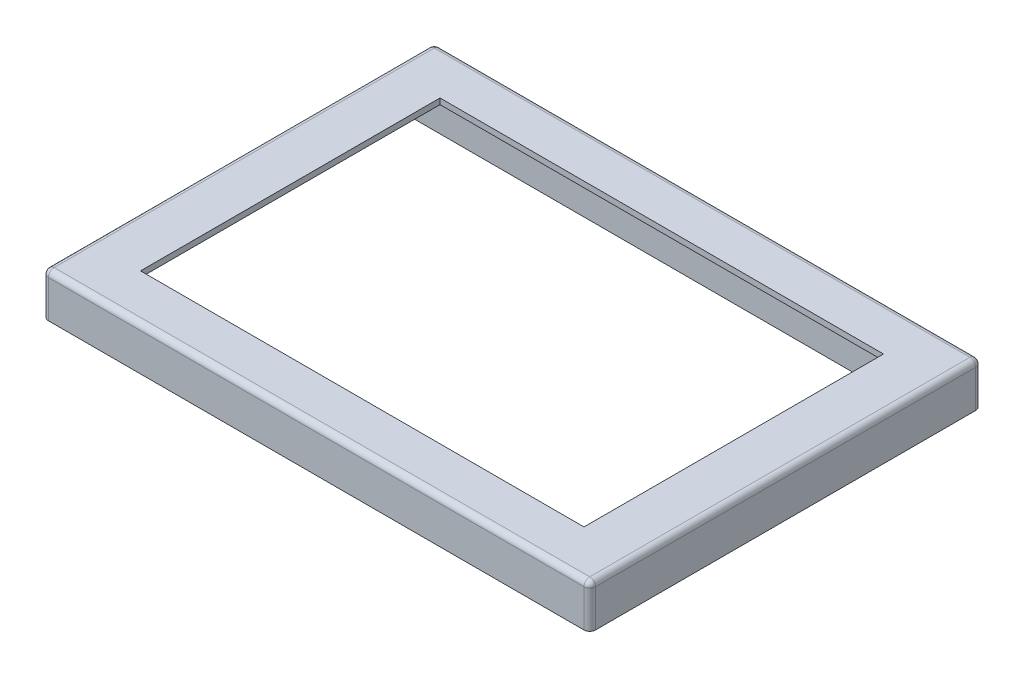
ISO-10303-21;
HEADER;
FILE_DESCRIPTION(('STEP AP214'),'2;1');
FILE_NAME('part.step','',(''),(''),'','','');
FILE_SCHEMA(('AUTOMOTIVE_DESIGN { 1 0 10303 214 1 1 1 1 }'));
ENDSEC;
DATA;
#1=APPLICATION_CONTEXT('core data for automotive mechanical design processes');
#2=APPLICATION_PROTOCOL_DEFINITION('international standard','automotive_design',2000,#1);
#3=PRODUCT_CONTEXT('',#1,'mechanical');
#4=PRODUCT('Part','Part','',(#3));
#5=PRODUCT_RELATED_PRODUCT_CATEGORY('part','',(#4));
#6=PRODUCT_DEFINITION_FORMATION('','',#4);
#7=PRODUCT_DEFINITION_CONTEXT('part definition',#1,'design');
#8=PRODUCT_DEFINITION('design','',#6,#7);
#9=PRODUCT_DEFINITION_SHAPE('','',#8);
#10=(LENGTH_UNIT() NAMED_UNIT(*) SI_UNIT(.MILLI.,.METRE.));
#11=(NAMED_UNIT(*) PLANE_ANGLE_UNIT() SI_UNIT($,.RADIAN.));
#12=(NAMED_UNIT(*) SI_UNIT($,.STERADIAN.) SOLID_ANGLE_UNIT());
#13=UNCERTAINTY_MEASURE_WITH_UNIT(LENGTH_MEASURE(1.E-05),#10,'distance_accuracy_value','');
#14=(GEOMETRIC_REPRESENTATION_CONTEXT(3) GLOBAL_UNCERTAINTY_ASSIGNED_CONTEXT((#13)) GLOBAL_UNIT_ASSIGNED_CONTEXT((#10,
#11,#12)) REPRESENTATION_CONTEXT('',''));
#15=CARTESIAN_POINT('',(0.,0.,0.));
#16=DIRECTION('',(0.,0.,1.));
#17=DIRECTION('',(1.,0.,0.));
#18=AXIS2_PLACEMENT_3D('',#15,#16,#17);
#19=CARTESIAN_POINT('',(47.5,7.5,34.));
#20=DIRECTION('',(-1.,0.,0.));
#21=DIRECTION('',(0.,0.,1.));
#22=AXIS2_PLACEMENT_3D('',#19,#20,#21);
#23=PLANE('',#22);
#24=DIRECTION('',(0.,0.,-1.));
#25=VECTOR('',#24,1.);
#26=CARTESIAN_POINT('',(47.5,6.5,34.));
#27=LINE('',#26,#25);
#28=CARTESIAN_POINT('',(47.5,6.5,-33.));
#29=VERTEX_POINT('',#28);
#30=CARTESIAN_POINT('',(47.5,6.5,33.));
#31=VERTEX_POINT('',#30);
#32=EDGE_CURVE('E326',#29,#31,#27,.F.);
#33=ORIENTED_EDGE('',*,*,#32,.T.);
#34=DIRECTION('',(0.,-1.,0.));
#35=VECTOR('',#34,1.);
#36=CARTESIAN_POINT('',(47.5,7.5,33.));
#37=LINE('',#36,#35);
#38=CARTESIAN_POINT('',(47.5,0.,33.));
#39=VERTEX_POINT('',#38);
#40=EDGE_CURVE('E354',#31,#39,#37,.T.);
#41=ORIENTED_EDGE('',*,*,#40,.T.);
#42=DIRECTION('',(0.,0.,-1.));
#43=VECTOR('',#42,1.);
#44=CARTESIAN_POINT('',(47.5,0.,34.));
#45=LINE('',#44,#43);
#46=CARTESIAN_POINT('',(47.5,0.,-33.));
#47=VERTEX_POINT('',#46);
#48=EDGE_CURVE('E275',#39,#47,#45,.T.);
#49=ORIENTED_EDGE('',*,*,#48,.T.);
#50=DIRECTION('',(0.,-1.,0.));
#51=VECTOR('',#50,1.);
#52=CARTESIAN_POINT('',(47.5,7.5,-33.));
#53=LINE('',#52,#51);
#54=EDGE_CURVE('E352',#47,#29,#53,.F.);
#55=ORIENTED_EDGE('',*,*,#54,.T.);
#56=EDGE_LOOP('',(#33,#41,#49,#55));
#57=FACE_BOUND('',#56,.T.);
#58=ADVANCED_FACE('F39',(#57),#23,.F.);
#59=CARTESIAN_POINT('',(-47.5,7.5,-34.));
#60=DIRECTION('',(0.,0.,1.));
#61=DIRECTION('',(1.,0.,0.));
#62=AXIS2_PLACEMENT_3D('',#59,#60,#61);
#63=PLANE('',#62);
#64=DIRECTION('',(-1.,0.,0.));
#65=VECTOR('',#64,1.);
#66=CARTESIAN_POINT('',(-47.5,6.5,-34.));
#67=LINE('',#66,#65);
#68=CARTESIAN_POINT('',(-46.5,6.5,-34.));
#69=VERTEX_POINT('',#68);
#70=CARTESIAN_POINT('',(46.5,6.5,-34.));
#71=VERTEX_POINT('',#70);
#72=EDGE_CURVE('E324',#69,#71,#67,.F.);
#73=ORIENTED_EDGE('',*,*,#72,.T.);
#74=DIRECTION('',(0.,-1.,0.));
#75=VECTOR('',#74,1.);
#76=CARTESIAN_POINT('',(46.5,7.5,-34.));
#77=LINE('',#76,#75);
#78=CARTESIAN_POINT('',(46.5,0.,-34.));
#79=VERTEX_POINT('',#78);
#80=EDGE_CURVE('E63',#71,#79,#77,.T.);
#81=ORIENTED_EDGE('',*,*,#80,.T.);
#82=DIRECTION('',(-1.,0.,0.));
#83=VECTOR('',#82,1.);
#84=CARTESIAN_POINT('',(-47.5,0.,-34.));
#85=LINE('',#84,#83);
#86=CARTESIAN_POINT('',(-46.5,0.,-34.));
#87=VERTEX_POINT('',#86);
#88=EDGE_CURVE('E292',#79,#87,#85,.T.);
#89=ORIENTED_EDGE('',*,*,#88,.T.);
#90=DIRECTION('',(0.,-1.,0.));
#91=VECTOR('',#90,1.);
#92=CARTESIAN_POINT('',(-46.5,7.5,-34.));
#93=LINE('',#92,#91);
#94=EDGE_CURVE('E367',#87,#69,#93,.F.);
#95=ORIENTED_EDGE('',*,*,#94,.T.);
#96=EDGE_LOOP('',(#73,#81,#89,#95));
#97=FACE_BOUND('',#96,.T.);
#98=ADVANCED_FACE('F423',(#97),#63,.F.);
#99=CARTESIAN_POINT('',(-47.5,7.5,34.));
#100=DIRECTION('',(1.,0.,0.));
#101=DIRECTION('',(0.,0.,-1.));
#102=AXIS2_PLACEMENT_3D('',#99,#100,#101);
#103=PLANE('',#102);
#104=DIRECTION('',(0.,0.,1.));
#105=VECTOR('',#104,1.);
#106=CARTESIAN_POINT('',(-47.5,6.5,34.));
#107=LINE('',#106,#105);
#108=CARTESIAN_POINT('',(-47.5,6.5,33.));
#109=VERTEX_POINT('',#108);
#110=CARTESIAN_POINT('',(-47.5,6.5,-33.));
#111=VERTEX_POINT('',#110);
#112=EDGE_CURVE('E321',#109,#111,#107,.F.);
#113=ORIENTED_EDGE('',*,*,#112,.T.);
#114=DIRECTION('',(0.,-1.,0.));
#115=VECTOR('',#114,1.);
#116=CARTESIAN_POINT('',(-47.5,7.5,-33.));
#117=LINE('',#116,#115);
#118=CARTESIAN_POINT('',(-47.5,0.,-33.));
#119=VERTEX_POINT('',#118);
#120=EDGE_CURVE('E11',#111,#119,#117,.T.);
#121=ORIENTED_EDGE('',*,*,#120,.T.);
#122=DIRECTION('',(0.,0.,1.));
#123=VECTOR('',#122,1.);
#124=CARTESIAN_POINT('',(-47.5,0.,34.));
#125=LINE('',#124,#123);
#126=CARTESIAN_POINT('',(-47.5,0.,33.));
#127=VERTEX_POINT('',#126);
#128=EDGE_CURVE('E294',#119,#127,#125,.T.);
#129=ORIENTED_EDGE('',*,*,#128,.T.);
#130=DIRECTION('',(0.,-1.,0.));
#131=VECTOR('',#130,1.);
#132=CARTESIAN_POINT('',(-47.5,7.5,33.));
#133=LINE('',#132,#131);
#134=EDGE_CURVE('E48',#127,#109,#133,.F.);
#135=ORIENTED_EDGE('',*,*,#134,.T.);
#136=EDGE_LOOP('',(#113,#121,#129,#135));
#137=FACE_BOUND('',#136,.T.);
#138=ADVANCED_FACE('F421',(#137),#103,.F.);
#139=CARTESIAN_POINT('',(-47.5,7.5,34.));
#140=DIRECTION('',(0.,0.,-1.));
#141=DIRECTION('',(-1.,0.,0.));
#142=AXIS2_PLACEMENT_3D('',#139,#140,#141);
#143=PLANE('',#142);
#144=DIRECTION('',(1.,0.,0.));
#145=VECTOR('',#144,1.);
#146=CARTESIAN_POINT('',(-47.5,0.,34.));
#147=LINE('',#146,#145);
#148=CARTESIAN_POINT('',(-46.5,0.,34.));
#149=VERTEX_POINT('',#148);
#150=CARTESIAN_POINT('',(46.5,0.,34.));
#151=VERTEX_POINT('',#150);
#152=EDGE_CURVE('E297',#149,#151,#147,.T.);
#153=ORIENTED_EDGE('',*,*,#152,.T.);
#154=DIRECTION('',(0.,-1.,0.));
#155=VECTOR('',#154,1.);
#156=CARTESIAN_POINT('',(46.5,7.5,34.));
#157=LINE('',#156,#155);
#158=CARTESIAN_POINT('',(46.5,6.5,34.));
#159=VERTEX_POINT('',#158);
#160=EDGE_CURVE('E365',#151,#159,#157,.F.);
#161=ORIENTED_EDGE('',*,*,#160,.T.);
#162=DIRECTION('',(1.,0.,0.));
#163=VECTOR('',#162,1.);
#164=CARTESIAN_POINT('',(-47.5,6.5,34.));
#165=LINE('',#164,#163);
#166=CARTESIAN_POINT('',(-46.5,6.5,34.));
#167=VERTEX_POINT('',#166);
#168=EDGE_CURVE('E329',#159,#167,#165,.F.);
#169=ORIENTED_EDGE('',*,*,#168,.T.);
#170=DIRECTION('',(0.,-1.,0.));
#171=VECTOR('',#170,1.);
#172=CARTESIAN_POINT('',(-46.5,7.5,34.));
#173=LINE('',#172,#171);
#174=EDGE_CURVE('E363',#167,#149,#173,.T.);
#175=ORIENTED_EDGE('',*,*,#174,.T.);
#176=EDGE_LOOP('',(#153,#161,#169,#175));
#177=FACE_BOUND('',#176,.T.);
#178=ADVANCED_FACE('F393',(#177),#143,.F.);
#179=CARTESIAN_POINT('',(0.,7.5,0.));
#180=DIRECTION('',(0.,-1.,0.));
#181=DIRECTION('',(0.,0.,-1.));
#182=AXIS2_PLACEMENT_3D('',#179,#180,#181);
#183=PLANE('',#182);
#184=DIRECTION('',(-1.,0.,0.));
#185=VECTOR('',#184,1.);
#186=CARTESIAN_POINT('',(0.,7.5,-33.));
#187=LINE('',#186,#185);
#188=CARTESIAN_POINT('',(46.5,7.5,-33.));
#189=VERTEX_POINT('',#188);
#190=CARTESIAN_POINT('',(-46.5,7.5,-33.));
#191=VERTEX_POINT('',#190);
#192=EDGE_CURVE('E315',#189,#191,#187,.T.);
#193=ORIENTED_EDGE('',*,*,#192,.T.);
#194=DIRECTION('',(0.,0.,1.));
#195=VECTOR('',#194,1.);
#196=CARTESIAN_POINT('',(-46.5,7.5,0.));
#197=LINE('',#196,#195);
#198=CARTESIAN_POINT('',(-46.5,7.5,33.));
#199=VERTEX_POINT('',#198);
#200=EDGE_CURVE('E318',#191,#199,#197,.T.);
#201=ORIENTED_EDGE('',*,*,#200,.T.);
#202=DIRECTION('',(1.,0.,0.));
#203=VECTOR('',#202,1.);
#204=CARTESIAN_POINT('',(0.,7.5,33.));
#205=LINE('',#204,#203);
#206=CARTESIAN_POINT('',(46.5,7.5,33.));
#207=VERTEX_POINT('',#206);
#208=EDGE_CURVE('E309',#199,#207,#205,.T.);
#209=ORIENTED_EDGE('',*,*,#208,.T.);
#210=DIRECTION('',(0.,0.,-1.));
#211=VECTOR('',#210,1.);
#212=CARTESIAN_POINT('',(46.5,7.5,0.));
#213=LINE('',#212,#211);
#214=EDGE_CURVE('E312',#207,#189,#213,.T.);
#215=ORIENTED_EDGE('',*,*,#214,.T.);
#216=EDGE_LOOP('',(#193,#201,#209,#215));
#217=FACE_BOUND('',#216,.T.);
#218=DIRECTION('',(1.,0.,0.));
#219=VECTOR('',#218,1.);
#220=CARTESIAN_POINT('',(-38.5,7.5,26.));
#221=LINE('',#220,#219);
#222=CARTESIAN_POINT('',(-38.5,7.5,26.));
#223=VERTEX_POINT('',#222);
#224=CARTESIAN_POINT('',(38.5,7.5,26.));
#225=VERTEX_POINT('',#224);
#226=EDGE_CURVE('E207',#223,#225,#221,.T.);
#227=ORIENTED_EDGE('',*,*,#226,.F.);
#228=DIRECTION('',(0.,0.,1.));
#229=VECTOR('',#228,1.);
#230=CARTESIAN_POINT('',(-38.5,7.5,-26.));
#231=LINE('',#230,#229);
#232=CARTESIAN_POINT('',(-38.5,7.5,-26.));
#233=VERTEX_POINT('',#232);
#234=EDGE_CURVE('E212',#233,#223,#231,.T.);
#235=ORIENTED_EDGE('',*,*,#234,.F.);
#236=DIRECTION('',(-1.,0.,0.));
#237=VECTOR('',#236,1.);
#238=CARTESIAN_POINT('',(-38.5,7.5,-26.));
#239=LINE('',#238,#237);
#240=CARTESIAN_POINT('',(38.5,7.5,-26.));
#241=VERTEX_POINT('',#240);
#242=EDGE_CURVE('E216',#241,#233,#239,.T.);
#243=ORIENTED_EDGE('',*,*,#242,.F.);
#244=DIRECTION('',(0.,0.,-1.));
#245=VECTOR('',#244,1.);
#246=CARTESIAN_POINT('',(38.5,7.5,-26.));
#247=LINE('',#246,#245);
#248=EDGE_CURVE('E196',#225,#241,#247,.T.);
#249=ORIENTED_EDGE('',*,*,#248,.F.);
#250=EDGE_LOOP('',(#227,#235,#243,#249));
#251=FACE_BOUND('',#250,.T.);
#252=ADVANCED_FACE('F214',(#217,#251),#183,.F.);
#253=CARTESIAN_POINT('',(0.,0.,0.));
#254=DIRECTION('',(0.,-1.,0.));
#255=DIRECTION('',(0.,0.,-1.));
#256=AXIS2_PLACEMENT_3D('',#253,#254,#255);
#257=PLANE('',#256);
#258=CARTESIAN_POINT('',(-44.5,0.,-31.));
#259=DIRECTION('',(0.,-1.,0.));
#260=DIRECTION('',(0.,0.,-1.));
#261=AXIS2_PLACEMENT_3D('',#258,#259,#260);
#262=CIRCLE('',#261,2.1);
#263=CARTESIAN_POINT('',(-44.5,0.,-33.1));
#264=VERTEX_POINT('',#263);
#265=EDGE_CURVE('E919',#264,#264,#262,.T.);
#266=ORIENTED_EDGE('',*,*,#265,.F.);
#267=EDGE_LOOP('',(#266));
#268=FACE_BOUND('',#267,.T.);
#269=CARTESIAN_POINT('',(0.,0.,-31.));
#270=DIRECTION('',(0.,-1.,0.));
#271=DIRECTION('',(0.,0.,-1.));
#272=AXIS2_PLACEMENT_3D('',#269,#270,#271);
#273=CIRCLE('',#272,2.1);
#274=CARTESIAN_POINT('',(0.,0.,-33.1));
#275=VERTEX_POINT('',#274);
#276=EDGE_CURVE('E923',#275,#275,#273,.T.);
#277=ORIENTED_EDGE('',*,*,#276,.F.);
#278=EDGE_LOOP('',(#277));
#279=FACE_BOUND('',#278,.T.);
#280=CARTESIAN_POINT('',(44.5,0.,-31.));
#281=DIRECTION('',(0.,-1.,0.));
#282=DIRECTION('',(0.,0.,-1.));
#283=AXIS2_PLACEMENT_3D('',#280,#281,#282);
#284=CIRCLE('',#283,2.1);
#285=CARTESIAN_POINT('',(44.5,0.,-33.1));
#286=VERTEX_POINT('',#285);
#287=EDGE_CURVE('E927',#286,#286,#284,.T.);
#288=ORIENTED_EDGE('',*,*,#287,.F.);
#289=EDGE_LOOP('',(#288));
#290=FACE_BOUND('',#289,.T.);
#291=CARTESIAN_POINT('',(44.5,0.,31.));
#292=DIRECTION('',(0.,-1.,0.));
#293=DIRECTION('',(0.,0.,-1.));
#294=AXIS2_PLACEMENT_3D('',#291,#292,#293);
#295=CIRCLE('',#294,2.1);
#296=CARTESIAN_POINT('',(44.5,0.,28.9));
#297=VERTEX_POINT('',#296);
#298=EDGE_CURVE('E931',#297,#297,#295,.T.);
#299=ORIENTED_EDGE('',*,*,#298,.F.);
#300=EDGE_LOOP('',(#299));
#301=FACE_BOUND('',#300,.T.);
#302=CARTESIAN_POINT('',(0.,0.,31.));
#303=DIRECTION('',(0.,-1.,0.));
#304=DIRECTION('',(0.,0.,-1.));
#305=AXIS2_PLACEMENT_3D('',#302,#303,#304);
#306=CIRCLE('',#305,2.1);
#307=CARTESIAN_POINT('',(0.,0.,28.9));
#308=VERTEX_POINT('',#307);
#309=EDGE_CURVE('E935',#308,#308,#306,.T.);
#310=ORIENTED_EDGE('',*,*,#309,.F.);
#311=EDGE_LOOP('',(#310));
#312=FACE_BOUND('',#311,.T.);
#313=CARTESIAN_POINT('',(-44.5,0.,31.));
#314=DIRECTION('',(0.,-1.,0.));
#315=DIRECTION('',(0.,0.,-1.));
#316=AXIS2_PLACEMENT_3D('',#313,#314,#315);
#317=CIRCLE('',#316,2.1);
#318=CARTESIAN_POINT('',(-44.5,0.,28.9));
#319=VERTEX_POINT('',#318);
#320=EDGE_CURVE('E939',#319,#319,#317,.T.);
#321=ORIENTED_EDGE('',*,*,#320,.F.);
#322=EDGE_LOOP('',(#321));
#323=FACE_BOUND('',#322,.T.);
#324=DIRECTION('',(0.,0.,-1.));
#325=VECTOR('',#324,1.);
#326=CARTESIAN_POINT('',(-45.5,0.,28.1));
#327=LINE('',#326,#325);
#328=CARTESIAN_POINT('',(-45.5,0.,28.1));
#329=VERTEX_POINT('',#328);
#330=CARTESIAN_POINT('',(-45.5,0.,25.));
#331=VERTEX_POINT('',#330);
#332=EDGE_CURVE('E223',#329,#331,#327,.T.);
#333=ORIENTED_EDGE('',*,*,#332,.F.);
#334=DIRECTION('',(-1.,0.,0.));
#335=VECTOR('',#334,1.);
#336=CARTESIAN_POINT('',(-45.5,0.,28.1));
#337=LINE('',#336,#335);
#338=CARTESIAN_POINT('',(40.5,0.,28.1));
#339=VERTEX_POINT('',#338);
#340=EDGE_CURVE('E230',#339,#329,#337,.T.);
#341=ORIENTED_EDGE('',*,*,#340,.F.);
#342=DIRECTION('',(0.,0.,1.));
#343=VECTOR('',#342,1.);
#344=CARTESIAN_POINT('',(40.5,0.,28.1));
#345=LINE('',#344,#343);
#346=CARTESIAN_POINT('',(40.5,0.,-28.1));
#347=VERTEX_POINT('',#346);
#348=EDGE_CURVE('E268',#347,#339,#345,.T.);
#349=ORIENTED_EDGE('',*,*,#348,.F.);
#350=DIRECTION('',(1.,0.,0.));
#351=VECTOR('',#350,1.);
#352=CARTESIAN_POINT('',(-45.5,0.,-28.1));
#353=LINE('',#352,#351);
#354=CARTESIAN_POINT('',(-45.5,0.,-28.1));
#355=VERTEX_POINT('',#354);
#356=EDGE_CURVE('E265',#355,#347,#353,.T.);
#357=ORIENTED_EDGE('',*,*,#356,.F.);
#358=DIRECTION('',(0.,0.,-1.));
#359=VECTOR('',#358,1.);
#360=CARTESIAN_POINT('',(-45.5,0.,-18.));
#361=LINE('',#360,#359);
#362=CARTESIAN_POINT('',(-45.5,0.,-18.));
#363=VERTEX_POINT('',#362);
#364=EDGE_CURVE('E262',#363,#355,#361,.T.);
#365=ORIENTED_EDGE('',*,*,#364,.F.);
#366=DIRECTION('',(1.,0.,0.));
#367=VECTOR('',#366,1.);
#368=CARTESIAN_POINT('',(-45.5,0.,-18.));
#369=LINE('',#368,#367);
#370=CARTESIAN_POINT('',(-46.,0.,-18.));
#371=VERTEX_POINT('',#370);
#372=EDGE_CURVE('E259',#371,#363,#369,.T.);
#373=ORIENTED_EDGE('',*,*,#372,.F.);
#374=DIRECTION('',(0.,0.,-1.));
#375=VECTOR('',#374,1.);
#376=CARTESIAN_POINT('',(-46.,0.,25.));
#377=LINE('',#376,#375);
#378=CARTESIAN_POINT('',(-46.,0.,25.));
#379=VERTEX_POINT('',#378);
#380=EDGE_CURVE('E256',#379,#371,#377,.T.);
#381=ORIENTED_EDGE('',*,*,#380,.F.);
#382=DIRECTION('',(-1.,0.,0.));
#383=VECTOR('',#382,1.);
#384=CARTESIAN_POINT('',(-45.5,0.,25.));
#385=LINE('',#384,#383);
#386=EDGE_CURVE('E253',#331,#379,#385,.T.);
#387=ORIENTED_EDGE('',*,*,#386,.F.);
#388=EDGE_LOOP('',(#333,#341,#349,#357,#365,#373,#381,#387));
#389=FACE_BOUND('',#388,.T.);
#390=ORIENTED_EDGE('',*,*,#48,.F.);
#391=CARTESIAN_POINT('',(46.5,0.,33.));
#392=DIRECTION('',(0.,-1.,0.));
#393=DIRECTION('',(0.,0.,-1.));
#394=AXIS2_PLACEMENT_3D('',#391,#392,#393);
#395=CIRCLE('',#394,1.);
#396=EDGE_CURVE('E361',#39,#151,#395,.T.);
#397=ORIENTED_EDGE('',*,*,#396,.T.);
#398=ORIENTED_EDGE('',*,*,#152,.F.);
#399=CARTESIAN_POINT('',(-46.5,0.,33.));
#400=DIRECTION('',(0.,-1.,0.));
#401=DIRECTION('',(0.,0.,-1.));
#402=AXIS2_PLACEMENT_3D('',#399,#400,#401);
#403=CIRCLE('',#402,1.);
#404=EDGE_CURVE('E356',#149,#127,#403,.T.);
#405=ORIENTED_EDGE('',*,*,#404,.T.);
#406=ORIENTED_EDGE('',*,*,#128,.F.);
#407=CARTESIAN_POINT('',(-46.5,0.,-33.));
#408=DIRECTION('',(0.,-1.,0.));
#409=DIRECTION('',(0.,0.,-1.));
#410=AXIS2_PLACEMENT_3D('',#407,#408,#409);
#411=CIRCLE('',#410,1.);
#412=EDGE_CURVE('E56',#119,#87,#411,.T.);
#413=ORIENTED_EDGE('',*,*,#412,.T.);
#414=ORIENTED_EDGE('',*,*,#88,.F.);
#415=CARTESIAN_POINT('',(46.5,0.,-33.));
#416=DIRECTION('',(0.,-1.,0.));
#417=DIRECTION('',(0.,0.,-1.));
#418=AXIS2_PLACEMENT_3D('',#415,#416,#417);
#419=CIRCLE('',#418,1.);
#420=EDGE_CURVE('E359',#79,#47,#419,.T.);
#421=ORIENTED_EDGE('',*,*,#420,.T.);
#422=EDGE_LOOP('',(#390,#397,#398,#405,#406,#413,#414,#421));
#423=FACE_BOUND('',#422,.T.);
#424=ADVANCED_FACE('F397',(#268,#279,#290,#301,#312,#323,#389,#423),#257,.T.);
#425=CARTESIAN_POINT('',(-45.5,6.5,28.1));
#426=DIRECTION('',(-1.,0.,0.));
#427=DIRECTION('',(0.,0.,1.));
#428=AXIS2_PLACEMENT_3D('',#425,#426,#427);
#429=PLANE('',#428);
#430=ORIENTED_EDGE('',*,*,#332,.T.);
#431=DIRECTION('',(0.,-1.,0.));
#432=VECTOR('',#431,1.);
#433=CARTESIAN_POINT('',(-45.5,6.5,25.));
#434=LINE('',#433,#432);
#435=CARTESIAN_POINT('',(-45.5,6.5,25.));
#436=VERTEX_POINT('',#435);
#437=EDGE_CURVE('E251',#436,#331,#434,.T.);
#438=ORIENTED_EDGE('',*,*,#437,.F.);
#439=DIRECTION('',(0.,0.,-1.));
#440=VECTOR('',#439,1.);
#441=CARTESIAN_POINT('',(-45.5,6.5,28.1));
#442=LINE('',#441,#440);
#443=CARTESIAN_POINT('',(-45.5,6.5,28.1));
#444=VERTEX_POINT('',#443);
#445=EDGE_CURVE('E226',#444,#436,#442,.T.);
#446=ORIENTED_EDGE('',*,*,#445,.F.);
#447=DIRECTION('',(0.,-1.,0.));
#448=VECTOR('',#447,1.);
#449=CARTESIAN_POINT('',(-45.5,6.5,28.1));
#450=LINE('',#449,#448);
#451=EDGE_CURVE('E273',#444,#329,#450,.T.);
#452=ORIENTED_EDGE('',*,*,#451,.T.);
#453=EDGE_LOOP('',(#430,#438,#446,#452));
#454=FACE_BOUND('',#453,.T.);
#455=ADVANCED_FACE('F699',(#454),#429,.F.);
#456=CARTESIAN_POINT('',(-45.5,6.5,28.1));
#457=DIRECTION('',(0.,0.,1.));
#458=DIRECTION('',(1.,0.,0.));
#459=AXIS2_PLACEMENT_3D('',#456,#457,#458);
#460=PLANE('',#459);
#461=ORIENTED_EDGE('',*,*,#340,.T.);
#462=ORIENTED_EDGE('',*,*,#451,.F.);
#463=DIRECTION('',(-1.,0.,0.));
#464=VECTOR('',#463,1.);
#465=CARTESIAN_POINT('',(-45.5,6.5,28.1));
#466=LINE('',#465,#464);
#467=CARTESIAN_POINT('',(40.5,6.5,28.1));
#468=VERTEX_POINT('',#467);
#469=EDGE_CURVE('E248',#468,#444,#466,.T.);
#470=ORIENTED_EDGE('',*,*,#469,.F.);
#471=DIRECTION('',(0.,-1.,0.));
#472=VECTOR('',#471,1.);
#473=CARTESIAN_POINT('',(40.5,6.5,28.1));
#474=LINE('',#473,#472);
#475=EDGE_CURVE('E276',#468,#339,#474,.T.);
#476=ORIENTED_EDGE('',*,*,#475,.T.);
#477=EDGE_LOOP('',(#461,#462,#470,#476));
#478=FACE_BOUND('',#477,.T.);
#479=ADVANCED_FACE('F691',(#478),#460,.F.);
#480=CARTESIAN_POINT('',(40.5,6.5,28.1));
#481=DIRECTION('',(1.,0.,0.));
#482=DIRECTION('',(0.,0.,-1.));
#483=AXIS2_PLACEMENT_3D('',#480,#481,#482);
#484=PLANE('',#483);
#485=ORIENTED_EDGE('',*,*,#348,.T.);
#486=ORIENTED_EDGE('',*,*,#475,.F.);
#487=DIRECTION('',(0.,0.,1.));
#488=VECTOR('',#487,1.);
#489=CARTESIAN_POINT('',(40.5,6.5,28.1));
#490=LINE('',#489,#488);
#491=CARTESIAN_POINT('',(40.5,6.5,-28.1));
#492=VERTEX_POINT('',#491);
#493=EDGE_CURVE('E245',#492,#468,#490,.T.);
#494=ORIENTED_EDGE('',*,*,#493,.F.);
#495=DIRECTION('',(0.,-1.,0.));
#496=VECTOR('',#495,1.);
#497=CARTESIAN_POINT('',(40.5,6.5,-28.1));
#498=LINE('',#497,#496);
#499=EDGE_CURVE('E278',#492,#347,#498,.T.);
#500=ORIENTED_EDGE('',*,*,#499,.T.);
#501=EDGE_LOOP('',(#485,#486,#494,#500));
#502=FACE_BOUND('',#501,.T.);
#503=ADVANCED_FACE('F683',(#502),#484,.F.);
#504=CARTESIAN_POINT('',(-45.5,6.5,-28.1));
#505=DIRECTION('',(0.,0.,-1.));
#506=DIRECTION('',(-1.,0.,0.));
#507=AXIS2_PLACEMENT_3D('',#504,#505,#506);
#508=PLANE('',#507);
#509=ORIENTED_EDGE('',*,*,#356,.T.);
#510=ORIENTED_EDGE('',*,*,#499,.F.);
#511=DIRECTION('',(1.,0.,0.));
#512=VECTOR('',#511,1.);
#513=CARTESIAN_POINT('',(-45.5,6.5,-28.1));
#514=LINE('',#513,#512);
#515=CARTESIAN_POINT('',(-45.5,6.5,-28.1));
#516=VERTEX_POINT('',#515);
#517=EDGE_CURVE('E242',#516,#492,#514,.T.);
#518=ORIENTED_EDGE('',*,*,#517,.F.);
#519=DIRECTION('',(0.,-1.,0.));
#520=VECTOR('',#519,1.);
#521=CARTESIAN_POINT('',(-45.5,6.5,-28.1));
#522=LINE('',#521,#520);
#523=EDGE_CURVE('E280',#516,#355,#522,.T.);
#524=ORIENTED_EDGE('',*,*,#523,.T.);
#525=EDGE_LOOP('',(#509,#510,#518,#524));
#526=FACE_BOUND('',#525,.T.);
#527=ADVANCED_FACE('F675',(#526),#508,.F.);
#528=CARTESIAN_POINT('',(-45.5,6.5,-18.));
#529=DIRECTION('',(-1.,0.,0.));
#530=DIRECTION('',(0.,0.,1.));
#531=AXIS2_PLACEMENT_3D('',#528,#529,#530);
#532=PLANE('',#531);
#533=ORIENTED_EDGE('',*,*,#364,.T.);
#534=ORIENTED_EDGE('',*,*,#523,.F.);
#535=DIRECTION('',(0.,0.,-1.));
#536=VECTOR('',#535,1.);
#537=CARTESIAN_POINT('',(-45.5,6.5,-18.));
#538=LINE('',#537,#536);
#539=CARTESIAN_POINT('',(-45.5,6.5,-18.));
#540=VERTEX_POINT('',#539);
#541=EDGE_CURVE('E239',#540,#516,#538,.T.);
#542=ORIENTED_EDGE('',*,*,#541,.F.);
#543=DIRECTION('',(0.,-1.,0.));
#544=VECTOR('',#543,1.);
#545=CARTESIAN_POINT('',(-45.5,6.5,-18.));
#546=LINE('',#545,#544);
#547=EDGE_CURVE('E282',#540,#363,#546,.T.);
#548=ORIENTED_EDGE('',*,*,#547,.T.);
#549=EDGE_LOOP('',(#533,#534,#542,#548));
#550=FACE_BOUND('',#549,.T.);
#551=ADVANCED_FACE('F667',(#550),#532,.F.);
#552=CARTESIAN_POINT('',(-45.5,6.5,-18.));
#553=DIRECTION('',(0.,0.,-1.));
#554=DIRECTION('',(-1.,0.,0.));
#555=AXIS2_PLACEMENT_3D('',#552,#553,#554);
#556=PLANE('',#555);
#557=ORIENTED_EDGE('',*,*,#372,.T.);
#558=ORIENTED_EDGE('',*,*,#547,.F.);
#559=DIRECTION('',(1.,0.,0.));
#560=VECTOR('',#559,1.);
#561=CARTESIAN_POINT('',(-45.5,6.5,-18.));
#562=LINE('',#561,#560);
#563=CARTESIAN_POINT('',(-46.,6.5,-18.));
#564=VERTEX_POINT('',#563);
#565=EDGE_CURVE('E236',#564,#540,#562,.T.);
#566=ORIENTED_EDGE('',*,*,#565,.F.);
#567=DIRECTION('',(0.,-1.,0.));
#568=VECTOR('',#567,1.);
#569=CARTESIAN_POINT('',(-46.,6.5,-18.));
#570=LINE('',#569,#568);
#571=EDGE_CURVE('E284',#564,#371,#570,.T.);
#572=ORIENTED_EDGE('',*,*,#571,.T.);
#573=EDGE_LOOP('',(#557,#558,#566,#572));
#574=FACE_BOUND('',#573,.T.);
#575=ADVANCED_FACE('F659',(#574),#556,.F.);
#576=CARTESIAN_POINT('',(-46.,6.5,25.));
#577=DIRECTION('',(-1.,0.,0.));
#578=DIRECTION('',(0.,0.,1.));
#579=AXIS2_PLACEMENT_3D('',#576,#577,#578);
#580=PLANE('',#579);
#581=ORIENTED_EDGE('',*,*,#380,.T.);
#582=ORIENTED_EDGE('',*,*,#571,.F.);
#583=DIRECTION('',(0.,0.,-1.));
#584=VECTOR('',#583,1.);
#585=CARTESIAN_POINT('',(-46.,6.5,25.));
#586=LINE('',#585,#584);
#587=CARTESIAN_POINT('',(-46.,6.5,25.));
#588=VERTEX_POINT('',#587);
#589=EDGE_CURVE('E233',#588,#564,#586,.T.);
#590=ORIENTED_EDGE('',*,*,#589,.F.);
#591=DIRECTION('',(0.,-1.,0.));
#592=VECTOR('',#591,1.);
#593=CARTESIAN_POINT('',(-46.,6.5,25.));
#594=LINE('',#593,#592);
#595=EDGE_CURVE('E286',#588,#379,#594,.T.);
#596=ORIENTED_EDGE('',*,*,#595,.T.);
#597=EDGE_LOOP('',(#581,#582,#590,#596));
#598=FACE_BOUND('',#597,.T.);
#599=ADVANCED_FACE('F651',(#598),#580,.F.);
#600=CARTESIAN_POINT('',(-45.5,6.5,25.));
#601=DIRECTION('',(0.,0.,1.));
#602=DIRECTION('',(1.,0.,0.));
#603=AXIS2_PLACEMENT_3D('',#600,#601,#602);
#604=PLANE('',#603);
#605=ORIENTED_EDGE('',*,*,#386,.T.);
#606=ORIENTED_EDGE('',*,*,#595,.F.);
#607=DIRECTION('',(-1.,0.,0.));
#608=VECTOR('',#607,1.);
#609=CARTESIAN_POINT('',(-45.5,6.5,25.));
#610=LINE('',#609,#608);
#611=EDGE_CURVE('E229',#436,#588,#610,.T.);
#612=ORIENTED_EDGE('',*,*,#611,.F.);
#613=ORIENTED_EDGE('',*,*,#437,.T.);
#614=EDGE_LOOP('',(#605,#606,#612,#613));
#615=FACE_BOUND('',#614,.T.);
#616=ADVANCED_FACE('F643',(#615),#604,.F.);
#617=CARTESIAN_POINT('',(0.,6.5,0.));
#618=DIRECTION('',(0.,1.,0.));
#619=DIRECTION('',(0.,0.,1.));
#620=AXIS2_PLACEMENT_3D('',#617,#618,#619);
#621=PLANE('',#620);
#622=DIRECTION('',(-1.,0.,0.));
#623=VECTOR('',#622,1.);
#624=CARTESIAN_POINT('',(0.,6.5,-26.));
#625=LINE('',#624,#623);
#626=CARTESIAN_POINT('',(38.5,6.5,-26.));
#627=VERTEX_POINT('',#626);
#628=CARTESIAN_POINT('',(-38.5,6.5,-26.));
#629=VERTEX_POINT('',#628);
#630=EDGE_CURVE('E303',#627,#629,#625,.T.);
#631=ORIENTED_EDGE('',*,*,#630,.T.);
#632=DIRECTION('',(0.,0.,1.));
#633=VECTOR('',#632,1.);
#634=CARTESIAN_POINT('',(-38.5,6.5,0.));
#635=LINE('',#634,#633);
#636=CARTESIAN_POINT('',(-38.5,6.5,26.));
#637=VERTEX_POINT('',#636);
#638=EDGE_CURVE('E306',#629,#637,#635,.T.);
#639=ORIENTED_EDGE('',*,*,#638,.T.);
#640=DIRECTION('',(1.,0.,0.));
#641=VECTOR('',#640,1.);
#642=CARTESIAN_POINT('',(0.,6.5,26.));
#643=LINE('',#642,#641);
#644=CARTESIAN_POINT('',(38.5,6.5,26.));
#645=VERTEX_POINT('',#644);
#646=EDGE_CURVE('E300',#637,#645,#643,.T.);
#647=ORIENTED_EDGE('',*,*,#646,.T.);
#648=DIRECTION('',(0.,0.,-1.));
#649=VECTOR('',#648,1.);
#650=CARTESIAN_POINT('',(38.5,6.5,0.));
#651=LINE('',#650,#649);
#652=EDGE_CURVE('E199',#645,#627,#651,.T.);
#653=ORIENTED_EDGE('',*,*,#652,.T.);
#654=EDGE_LOOP('',(#631,#639,#647,#653));
#655=FACE_BOUND('',#654,.T.);
#656=ORIENTED_EDGE('',*,*,#445,.T.);
#657=ORIENTED_EDGE('',*,*,#611,.T.);
#658=ORIENTED_EDGE('',*,*,#589,.T.);
#659=ORIENTED_EDGE('',*,*,#565,.T.);
#660=ORIENTED_EDGE('',*,*,#541,.T.);
#661=ORIENTED_EDGE('',*,*,#517,.T.);
#662=ORIENTED_EDGE('',*,*,#493,.T.);
#663=ORIENTED_EDGE('',*,*,#469,.T.);
#664=EDGE_LOOP('',(#656,#657,#658,#659,#660,#661,#662,#663));
#665=FACE_BOUND('',#664,.T.);
#666=ADVANCED_FACE('F635',(#655,#665),#621,.F.);
#667=CARTESIAN_POINT('',(-38.5,0.,-26.));
#668=DIRECTION('',(-1.,0.,0.));
#669=DIRECTION('',(0.,0.,1.));
#670=AXIS2_PLACEMENT_3D('',#667,#668,#669);
#671=PLANE('',#670);
#672=DIRECTION('',(0.,1.,0.));
#673=VECTOR('',#672,1.);
#674=CARTESIAN_POINT('',(-38.5,0.,-26.));
#675=LINE('',#674,#673);
#676=EDGE_CURVE('E221',#629,#233,#675,.T.);
#677=ORIENTED_EDGE('',*,*,#676,.T.);
#678=ORIENTED_EDGE('',*,*,#234,.T.);
#679=DIRECTION('',(0.,1.,0.));
#680=VECTOR('',#679,1.);
#681=CARTESIAN_POINT('',(-38.5,0.,26.));
#682=LINE('',#681,#680);
#683=EDGE_CURVE('E203',#637,#223,#682,.T.);
#684=ORIENTED_EDGE('',*,*,#683,.F.);
#685=ORIENTED_EDGE('',*,*,#638,.F.);
#686=EDGE_LOOP('',(#677,#678,#684,#685));
#687=FACE_BOUND('',#686,.T.);
#688=ADVANCED_FACE('F627',(#687),#671,.F.);
#689=CARTESIAN_POINT('',(-38.5,0.,-26.));
#690=DIRECTION('',(0.,0.,-1.));
#691=DIRECTION('',(-1.,0.,0.));
#692=AXIS2_PLACEMENT_3D('',#689,#690,#691);
#693=PLANE('',#692);
#694=DIRECTION('',(0.,1.,0.));
#695=VECTOR('',#694,1.);
#696=CARTESIAN_POINT('',(38.5,0.,-26.));
#697=LINE('',#696,#695);
#698=EDGE_CURVE('E202',#627,#241,#697,.T.);
#699=ORIENTED_EDGE('',*,*,#698,.T.);
#700=ORIENTED_EDGE('',*,*,#242,.T.);
#701=ORIENTED_EDGE('',*,*,#676,.F.);
#702=ORIENTED_EDGE('',*,*,#630,.F.);
#703=EDGE_LOOP('',(#699,#700,#701,#702));
#704=FACE_BOUND('',#703,.T.);
#705=ADVANCED_FACE('F620',(#704),#693,.F.);
#706=CARTESIAN_POINT('',(38.5,0.,-26.));
#707=DIRECTION('',(1.,0.,0.));
#708=DIRECTION('',(0.,0.,-1.));
#709=AXIS2_PLACEMENT_3D('',#706,#707,#708);
#710=PLANE('',#709);
#711=DIRECTION('',(0.,1.,0.));
#712=VECTOR('',#711,1.);
#713=CARTESIAN_POINT('',(38.5,0.,26.));
#714=LINE('',#713,#712);
#715=EDGE_CURVE('E191',#645,#225,#714,.T.);
#716=ORIENTED_EDGE('',*,*,#715,.T.);
#717=ORIENTED_EDGE('',*,*,#248,.T.);
#718=ORIENTED_EDGE('',*,*,#698,.F.);
#719=ORIENTED_EDGE('',*,*,#652,.F.);
#720=EDGE_LOOP('',(#716,#717,#718,#719));
#721=FACE_BOUND('',#720,.T.);
#722=ADVANCED_FACE('F193',(#721),#710,.F.);
#723=CARTESIAN_POINT('',(-38.5,0.,26.));
#724=DIRECTION('',(0.,0.,1.));
#725=DIRECTION('',(1.,0.,0.));
#726=AXIS2_PLACEMENT_3D('',#723,#724,#725);
#727=PLANE('',#726);
#728=ORIENTED_EDGE('',*,*,#683,.T.);
#729=ORIENTED_EDGE('',*,*,#226,.T.);
#730=ORIENTED_EDGE('',*,*,#715,.F.);
#731=ORIENTED_EDGE('',*,*,#646,.F.);
#732=EDGE_LOOP('',(#728,#729,#730,#731));
#733=FACE_BOUND('',#732,.T.);
#734=ADVANCED_FACE('F208',(#733),#727,.F.);
#735=CARTESIAN_POINT('',(-44.5,2.6,31.));
#736=DIRECTION('',(0.,-1.,0.));
#737=DIRECTION('',(0.,0.,-1.));
#738=AXIS2_PLACEMENT_3D('',#735,#736,#737);
#739=CYLINDRICAL_SURFACE('',#738,2.1);
#740=CARTESIAN_POINT('',(-44.5,2.6,31.));
#741=DIRECTION('',(0.,-1.,0.));
#742=DIRECTION('',(0.,0.,-1.));
#743=AXIS2_PLACEMENT_3D('',#740,#741,#742);
#744=CIRCLE('',#743,2.1);
#745=CARTESIAN_POINT('',(-44.5,2.6,28.9));
#746=VERTEX_POINT('',#745);
#747=EDGE_CURVE('E958',#746,#746,#744,.T.);
#748=ORIENTED_EDGE('',*,*,#747,.F.);
#749=EDGE_LOOP('',(#748));
#750=FACE_BOUND('',#749,.T.);
#751=ORIENTED_EDGE('',*,*,#320,.T.);
#752=EDGE_LOOP('',(#751));
#753=FACE_BOUND('',#752,.T.);
#754=ADVANCED_FACE('F599',(#750,#753),#739,.F.);
#755=CARTESIAN_POINT('',(-44.5,2.6,31.));
#756=DIRECTION('',(0.,-1.,0.));
#757=DIRECTION('',(0.,0.,-1.));
#758=AXIS2_PLACEMENT_3D('',#755,#756,#757);
#759=PLANE('',#758);
#760=ORIENTED_EDGE('',*,*,#747,.T.);
#761=EDGE_LOOP('',(#760));
#762=FACE_BOUND('',#761,.T.);
#763=ADVANCED_FACE('F591',(#762),#759,.T.);
#764=CARTESIAN_POINT('',(0.,2.6,31.));
#765=DIRECTION('',(0.,-1.,0.));
#766=DIRECTION('',(0.,0.,-1.));
#767=AXIS2_PLACEMENT_3D('',#764,#765,#766);
#768=CYLINDRICAL_SURFACE('',#767,2.1);
#769=CARTESIAN_POINT('',(0.,2.6,31.));
#770=DIRECTION('',(0.,-1.,0.));
#771=DIRECTION('',(0.,0.,-1.));
#772=AXIS2_PLACEMENT_3D('',#769,#770,#771);
#773=CIRCLE('',#772,2.1);
#774=CARTESIAN_POINT('',(0.,2.6,28.9));
#775=VERTEX_POINT('',#774);
#776=EDGE_CURVE('E962',#775,#775,#773,.T.);
#777=ORIENTED_EDGE('',*,*,#776,.F.);
#778=EDGE_LOOP('',(#777));
#779=FACE_BOUND('',#778,.T.);
#780=ORIENTED_EDGE('',*,*,#309,.T.);
#781=EDGE_LOOP('',(#780));
#782=FACE_BOUND('',#781,.T.);
#783=ADVANCED_FACE('F583',(#779,#782),#768,.F.);
#784=CARTESIAN_POINT('',(0.,2.6,31.));
#785=DIRECTION('',(0.,-1.,0.));
#786=DIRECTION('',(0.,0.,-1.));
#787=AXIS2_PLACEMENT_3D('',#784,#785,#786);
#788=PLANE('',#787);
#789=ORIENTED_EDGE('',*,*,#776,.T.);
#790=EDGE_LOOP('',(#789));
#791=FACE_BOUND('',#790,.T.);
#792=ADVANCED_FACE('F575',(#791),#788,.T.);
#793=CARTESIAN_POINT('',(44.5,2.6,31.));
#794=DIRECTION('',(0.,-1.,0.));
#795=DIRECTION('',(0.,0.,-1.));
#796=AXIS2_PLACEMENT_3D('',#793,#794,#795);
#797=CYLINDRICAL_SURFACE('',#796,2.1);
#798=CARTESIAN_POINT('',(44.5,2.6,31.));
#799=DIRECTION('',(0.,-1.,0.));
#800=DIRECTION('',(0.,0.,-1.));
#801=AXIS2_PLACEMENT_3D('',#798,#799,#800);
#802=CIRCLE('',#801,2.1);
#803=CARTESIAN_POINT('',(44.5,2.6,28.9));
#804=VERTEX_POINT('',#803);
#805=EDGE_CURVE('E977',#804,#804,#802,.T.);
#806=ORIENTED_EDGE('',*,*,#805,.F.);
#807=EDGE_LOOP('',(#806));
#808=FACE_BOUND('',#807,.T.);
#809=ORIENTED_EDGE('',*,*,#298,.T.);
#810=EDGE_LOOP('',(#809));
#811=FACE_BOUND('',#810,.T.);
#812=ADVANCED_FACE('F567',(#808,#811),#797,.F.);
#813=CARTESIAN_POINT('',(44.5,2.6,31.));
#814=DIRECTION('',(0.,-1.,0.));
#815=DIRECTION('',(0.,0.,-1.));
#816=AXIS2_PLACEMENT_3D('',#813,#814,#815);
#817=PLANE('',#816);
#818=ORIENTED_EDGE('',*,*,#805,.T.);
#819=EDGE_LOOP('',(#818));
#820=FACE_BOUND('',#819,.T.);
#821=ADVANCED_FACE('F559',(#820),#817,.T.);
#822=CARTESIAN_POINT('',(44.5,2.6,-31.));
#823=DIRECTION('',(0.,-1.,0.));
#824=DIRECTION('',(0.,0.,-1.));
#825=AXIS2_PLACEMENT_3D('',#822,#823,#824);
#826=CYLINDRICAL_SURFACE('',#825,2.1);
#827=CARTESIAN_POINT('',(44.5,2.6,-31.));
#828=DIRECTION('',(0.,-1.,0.));
#829=DIRECTION('',(0.,0.,-1.));
#830=AXIS2_PLACEMENT_3D('',#827,#828,#829);
#831=CIRCLE('',#830,2.1);
#832=CARTESIAN_POINT('',(44.5,2.6,-33.1));
#833=VERTEX_POINT('',#832);
#834=EDGE_CURVE('E973',#833,#833,#831,.T.);
#835=ORIENTED_EDGE('',*,*,#834,.F.);
#836=EDGE_LOOP('',(#835));
#837=FACE_BOUND('',#836,.T.);
#838=ORIENTED_EDGE('',*,*,#287,.T.);
#839=EDGE_LOOP('',(#838));
#840=FACE_BOUND('',#839,.T.);
#841=ADVANCED_FACE('F551',(#837,#840),#826,.F.);
#842=CARTESIAN_POINT('',(44.5,2.6,-31.));
#843=DIRECTION('',(0.,-1.,0.));
#844=DIRECTION('',(0.,0.,-1.));
#845=AXIS2_PLACEMENT_3D('',#842,#843,#844);
#846=PLANE('',#845);
#847=ORIENTED_EDGE('',*,*,#834,.T.);
#848=EDGE_LOOP('',(#847));
#849=FACE_BOUND('',#848,.T.);
#850=ADVANCED_FACE('F543',(#849),#846,.T.);
#851=CARTESIAN_POINT('',(0.,2.6,-31.));
#852=DIRECTION('',(0.,-1.,0.));
#853=DIRECTION('',(0.,0.,-1.));
#854=AXIS2_PLACEMENT_3D('',#851,#852,#853);
#855=CYLINDRICAL_SURFACE('',#854,2.1);
#856=CARTESIAN_POINT('',(0.,2.6,-31.));
#857=DIRECTION('',(0.,-1.,0.));
#858=DIRECTION('',(0.,0.,-1.));
#859=AXIS2_PLACEMENT_3D('',#856,#857,#858);
#860=CIRCLE('',#859,2.1);
#861=CARTESIAN_POINT('',(0.,2.6,-33.1));
#862=VERTEX_POINT('',#861);
#863=EDGE_CURVE('E969',#862,#862,#860,.T.);
#864=ORIENTED_EDGE('',*,*,#863,.F.);
#865=EDGE_LOOP('',(#864));
#866=FACE_BOUND('',#865,.T.);
#867=ORIENTED_EDGE('',*,*,#276,.T.);
#868=EDGE_LOOP('',(#867));
#869=FACE_BOUND('',#868,.T.);
#870=ADVANCED_FACE('F535',(#866,#869),#855,.F.);
#871=CARTESIAN_POINT('',(0.,2.6,-31.));
#872=DIRECTION('',(0.,-1.,0.));
#873=DIRECTION('',(0.,0.,-1.));
#874=AXIS2_PLACEMENT_3D('',#871,#872,#873);
#875=PLANE('',#874);
#876=ORIENTED_EDGE('',*,*,#863,.T.);
#877=EDGE_LOOP('',(#876));
#878=FACE_BOUND('',#877,.T.);
#879=ADVANCED_FACE('F527',(#878),#875,.T.);
#880=CARTESIAN_POINT('',(-44.5,2.6,-31.));
#881=DIRECTION('',(0.,-1.,0.));
#882=DIRECTION('',(0.,0.,-1.));
#883=AXIS2_PLACEMENT_3D('',#880,#881,#882);
#884=CYLINDRICAL_SURFACE('',#883,2.1);
#885=CARTESIAN_POINT('',(-44.5,2.6,-31.));
#886=DIRECTION('',(0.,-1.,0.));
#887=DIRECTION('',(0.,0.,-1.));
#888=AXIS2_PLACEMENT_3D('',#885,#886,#887);
#889=CIRCLE('',#888,2.1);
#890=CARTESIAN_POINT('',(-44.5,2.6,-33.1));
#891=VERTEX_POINT('',#890);
#892=EDGE_CURVE('E374',#891,#891,#889,.T.);
#893=ORIENTED_EDGE('',*,*,#892,.F.);
#894=EDGE_LOOP('',(#893));
#895=FACE_BOUND('',#894,.T.);
#896=ORIENTED_EDGE('',*,*,#265,.T.);
#897=EDGE_LOOP('',(#896));
#898=FACE_BOUND('',#897,.T.);
#899=ADVANCED_FACE('F519',(#895,#898),#884,.F.);
#900=CARTESIAN_POINT('',(-44.5,2.6,-31.));
#901=DIRECTION('',(0.,-1.,0.));
#902=DIRECTION('',(0.,0.,-1.));
#903=AXIS2_PLACEMENT_3D('',#900,#901,#902);
#904=PLANE('',#903);
#905=ORIENTED_EDGE('',*,*,#892,.T.);
#906=EDGE_LOOP('',(#905));
#907=FACE_BOUND('',#906,.T.);
#908=ADVANCED_FACE('F447',(#907),#904,.T.);
#909=CARTESIAN_POINT('',(46.5,6.5,0.));
#910=DIRECTION('',(0.,0.,-1.));
#911=DIRECTION('',(-1.,0.,0.));
#912=AXIS2_PLACEMENT_3D('',#909,#910,#911);
#913=CYLINDRICAL_SURFACE('',#912,1.);
#914=ORIENTED_EDGE('',*,*,#214,.F.);
#915=CARTESIAN_POINT('',(46.5,6.5,33.));
#916=DIRECTION('',(0.,0.,-1.));
#917=DIRECTION('',(-1.,0.,0.));
#918=AXIS2_PLACEMENT_3D('',#915,#916,#917);
#919=CIRCLE('',#918,1.);
#920=EDGE_CURVE('E339',#207,#31,#919,.T.);
#921=ORIENTED_EDGE('',*,*,#920,.T.);
#922=ORIENTED_EDGE('',*,*,#32,.F.);
#923=CARTESIAN_POINT('',(46.5,6.5,-33.));
#924=DIRECTION('',(0.,0.,-1.));
#925=DIRECTION('',(-1.,0.,0.));
#926=AXIS2_PLACEMENT_3D('',#923,#924,#925);
#927=CIRCLE('',#926,1.);
#928=EDGE_CURVE('E337',#29,#189,#927,.F.);
#929=ORIENTED_EDGE('',*,*,#928,.T.);
#930=EDGE_LOOP('',(#914,#921,#922,#929));
#931=FACE_BOUND('',#930,.T.);
#932=ADVANCED_FACE('F444',(#931),#913,.T.);
#933=CARTESIAN_POINT('',(0.,6.5,-33.));
#934=DIRECTION('',(-1.,0.,0.));
#935=DIRECTION('',(0.,0.,1.));
#936=AXIS2_PLACEMENT_3D('',#933,#934,#935);
#937=CYLINDRICAL_SURFACE('',#936,1.);
#938=ORIENTED_EDGE('',*,*,#192,.F.);
#939=CARTESIAN_POINT('',(46.5,6.5,-33.));
#940=DIRECTION('',(-1.,0.,0.));
#941=DIRECTION('',(0.,0.,1.));
#942=AXIS2_PLACEMENT_3D('',#939,#940,#941);
#943=CIRCLE('',#942,1.);
#944=EDGE_CURVE('E343',#189,#71,#943,.T.);
#945=ORIENTED_EDGE('',*,*,#944,.T.);
#946=ORIENTED_EDGE('',*,*,#72,.F.);
#947=CARTESIAN_POINT('',(-46.5,6.5,-33.));
#948=DIRECTION('',(-1.,0.,0.));
#949=DIRECTION('',(0.,0.,1.));
#950=AXIS2_PLACEMENT_3D('',#947,#948,#949);
#951=CIRCLE('',#950,1.);
#952=EDGE_CURVE('E341',#69,#191,#951,.F.);
#953=ORIENTED_EDGE('',*,*,#952,.T.);
#954=EDGE_LOOP('',(#938,#945,#946,#953));
#955=FACE_BOUND('',#954,.T.);
#956=ADVANCED_FACE('F441',(#955),#937,.T.);
#957=CARTESIAN_POINT('',(0.,6.5,33.));
#958=DIRECTION('',(1.,0.,0.));
#959=DIRECTION('',(0.,0.,-1.));
#960=AXIS2_PLACEMENT_3D('',#957,#958,#959);
#961=CYLINDRICAL_SURFACE('',#960,1.);
#962=ORIENTED_EDGE('',*,*,#168,.F.);
#963=CARTESIAN_POINT('',(46.5,6.5,33.));
#964=DIRECTION('',(1.,0.,0.));
#965=DIRECTION('',(0.,0.,-1.));
#966=AXIS2_PLACEMENT_3D('',#963,#964,#965);
#967=CIRCLE('',#966,1.);
#968=EDGE_CURVE('E334',#159,#207,#967,.F.);
#969=ORIENTED_EDGE('',*,*,#968,.T.);
#970=ORIENTED_EDGE('',*,*,#208,.F.);
#971=CARTESIAN_POINT('',(-46.5,6.5,33.));
#972=DIRECTION('',(1.,0.,0.));
#973=DIRECTION('',(0.,0.,-1.));
#974=AXIS2_PLACEMENT_3D('',#971,#972,#973);
#975=CIRCLE('',#974,1.);
#976=EDGE_CURVE('E332',#199,#167,#975,.T.);
#977=ORIENTED_EDGE('',*,*,#976,.T.);
#978=EDGE_LOOP('',(#962,#969,#970,#977));
#979=FACE_BOUND('',#978,.T.);
#980=ADVANCED_FACE('F405',(#979),#961,.T.);
#981=CARTESIAN_POINT('',(-46.5,6.5,0.));
#982=DIRECTION('',(0.,0.,1.));
#983=DIRECTION('',(1.,0.,0.));
#984=AXIS2_PLACEMENT_3D('',#981,#982,#983);
#985=CYLINDRICAL_SURFACE('',#984,1.);
#986=ORIENTED_EDGE('',*,*,#200,.F.);
#987=CARTESIAN_POINT('',(-46.5,6.5,-33.));
#988=DIRECTION('',(0.,0.,1.));
#989=DIRECTION('',(1.,0.,0.));
#990=AXIS2_PLACEMENT_3D('',#987,#988,#989);
#991=CIRCLE('',#990,1.);
#992=EDGE_CURVE('E349',#191,#111,#991,.T.);
#993=ORIENTED_EDGE('',*,*,#992,.T.);
#994=ORIENTED_EDGE('',*,*,#112,.F.);
#995=CARTESIAN_POINT('',(-46.5,6.5,33.));
#996=DIRECTION('',(0.,0.,1.));
#997=DIRECTION('',(1.,0.,0.));
#998=AXIS2_PLACEMENT_3D('',#995,#996,#997);
#999=CIRCLE('',#998,1.);
#1000=EDGE_CURVE('E346',#109,#199,#999,.F.);
#1001=ORIENTED_EDGE('',*,*,#1000,.T.);
#1002=EDGE_LOOP('',(#986,#993,#994,#1001));
#1003=FACE_BOUND('',#1002,.T.);
#1004=ADVANCED_FACE('F412',(#1003),#985,.T.);
#1005=CARTESIAN_POINT('',(46.5,7.5,33.));
#1006=DIRECTION('',(0.,-1.,0.));
#1007=DIRECTION('',(0.,0.,-1.));
#1008=AXIS2_PLACEMENT_3D('',#1005,#1006,#1007);
#1009=CYLINDRICAL_SURFACE('',#1008,1.);
#1010=ORIENTED_EDGE('',*,*,#396,.F.);
#1011=ORIENTED_EDGE('',*,*,#40,.F.);
#1012=CARTESIAN_POINT('',(46.5,6.5,33.));
#1013=DIRECTION('',(0.,1.,0.));
#1014=DIRECTION('',(0.,0.,1.));
#1015=AXIS2_PLACEMENT_3D('',#1012,#1013,#1014);
#1016=CIRCLE('',#1015,1.);
#1017=EDGE_CURVE('E371',#159,#31,#1016,.T.);
#1018=ORIENTED_EDGE('',*,*,#1017,.F.);
#1019=ORIENTED_EDGE('',*,*,#160,.F.);
#1020=EDGE_LOOP('',(#1010,#1011,#1018,#1019));
#1021=FACE_BOUND('',#1020,.T.);
#1022=ADVANCED_FACE('F401',(#1021),#1009,.T.);
#1023=CARTESIAN_POINT('',(46.5,6.5,33.));
#1024=DIRECTION('',(0.,0.,1.));
#1025=DIRECTION('',(1.,0.,0.));
#1026=AXIS2_PLACEMENT_3D('',#1023,#1024,#1025);
#1027=SPHERICAL_SURFACE('',#1026,1.);
#1028=ORIENTED_EDGE('',*,*,#1017,.T.);
#1029=ORIENTED_EDGE('',*,*,#920,.F.);
#1030=ORIENTED_EDGE('',*,*,#968,.F.);
#1031=EDGE_LOOP('',(#1028,#1029,#1030));
#1032=FACE_BOUND('',#1031,.T.);
#1033=ADVANCED_FACE('F449',(#1032),#1027,.T.);
#1034=CARTESIAN_POINT('',(46.5,7.5,-33.));
#1035=DIRECTION('',(0.,-1.,0.));
#1036=DIRECTION('',(0.,0.,-1.));
#1037=AXIS2_PLACEMENT_3D('',#1034,#1035,#1036);
#1038=CYLINDRICAL_SURFACE('',#1037,1.);
#1039=ORIENTED_EDGE('',*,*,#420,.F.);
#1040=ORIENTED_EDGE('',*,*,#80,.F.);
#1041=CARTESIAN_POINT('',(46.5,6.5,-33.));
#1042=DIRECTION('',(0.,1.,0.));
#1043=DIRECTION('',(0.,0.,1.));
#1044=AXIS2_PLACEMENT_3D('',#1041,#1042,#1043);
#1045=CIRCLE('',#1044,1.);
#1046=EDGE_CURVE('E375',#29,#71,#1045,.T.);
#1047=ORIENTED_EDGE('',*,*,#1046,.F.);
#1048=ORIENTED_EDGE('',*,*,#54,.F.);
#1049=EDGE_LOOP('',(#1039,#1040,#1047,#1048));
#1050=FACE_BOUND('',#1049,.T.);
#1051=ADVANCED_FACE('F452',(#1050),#1038,.T.);
#1052=CARTESIAN_POINT('',(46.5,6.5,-33.));
#1053=DIRECTION('',(0.,0.,1.));
#1054=DIRECTION('',(1.,0.,0.));
#1055=AXIS2_PLACEMENT_3D('',#1052,#1053,#1054);
#1056=SPHERICAL_SURFACE('',#1055,1.);
#1057=ORIENTED_EDGE('',*,*,#944,.F.);
#1058=ORIENTED_EDGE('',*,*,#928,.F.);
#1059=ORIENTED_EDGE('',*,*,#1046,.T.);
#1060=EDGE_LOOP('',(#1057,#1058,#1059));
#1061=FACE_BOUND('',#1060,.T.);
#1062=ADVANCED_FACE('F456',(#1061),#1056,.T.);
#1063=CARTESIAN_POINT('',(-46.5,7.5,-33.));
#1064=DIRECTION('',(0.,-1.,0.));
#1065=DIRECTION('',(0.,0.,-1.));
#1066=AXIS2_PLACEMENT_3D('',#1063,#1064,#1065);
#1067=CYLINDRICAL_SURFACE('',#1066,1.);
#1068=ORIENTED_EDGE('',*,*,#412,.F.);
#1069=ORIENTED_EDGE('',*,*,#120,.F.);
#1070=CARTESIAN_POINT('',(-46.5,6.5,-33.));
#1071=DIRECTION('',(0.,1.,0.));
#1072=DIRECTION('',(0.,0.,1.));
#1073=AXIS2_PLACEMENT_3D('',#1070,#1071,#1072);
#1074=CIRCLE('',#1073,1.);
#1075=EDGE_CURVE('E376',#69,#111,#1074,.T.);
#1076=ORIENTED_EDGE('',*,*,#1075,.F.);
#1077=ORIENTED_EDGE('',*,*,#94,.F.);
#1078=EDGE_LOOP('',(#1068,#1069,#1076,#1077));
#1079=FACE_BOUND('',#1078,.T.);
#1080=ADVANCED_FACE('F419',(#1079),#1067,.T.);
#1081=CARTESIAN_POINT('',(-46.5,6.5,-33.));
#1082=DIRECTION('',(0.,0.,1.));
#1083=DIRECTION('',(1.,0.,0.));
#1084=AXIS2_PLACEMENT_3D('',#1081,#1082,#1083);
#1085=SPHERICAL_SURFACE('',#1084,1.);
#1086=ORIENTED_EDGE('',*,*,#992,.F.);
#1087=ORIENTED_EDGE('',*,*,#952,.F.);
#1088=ORIENTED_EDGE('',*,*,#1075,.T.);
#1089=EDGE_LOOP('',(#1086,#1087,#1088));
#1090=FACE_BOUND('',#1089,.T.);
#1091=ADVANCED_FACE('F414',(#1090),#1085,.T.);
#1092=CARTESIAN_POINT('',(-46.5,7.5,33.));
#1093=DIRECTION('',(0.,-1.,0.));
#1094=DIRECTION('',(0.,0.,-1.));
#1095=AXIS2_PLACEMENT_3D('',#1092,#1093,#1094);
#1096=CYLINDRICAL_SURFACE('',#1095,1.);
#1097=ORIENTED_EDGE('',*,*,#404,.F.);
#1098=ORIENTED_EDGE('',*,*,#174,.F.);
#1099=CARTESIAN_POINT('',(-46.5,6.5,33.));
#1100=DIRECTION('',(0.,1.,0.));
#1101=DIRECTION('',(0.,0.,1.));
#1102=AXIS2_PLACEMENT_3D('',#1099,#1100,#1101);
#1103=CIRCLE('',#1102,1.);
#1104=EDGE_CURVE('E43',#109,#167,#1103,.T.);
#1105=ORIENTED_EDGE('',*,*,#1104,.F.);
#1106=ORIENTED_EDGE('',*,*,#134,.F.);
#1107=EDGE_LOOP('',(#1097,#1098,#1105,#1106));
#1108=FACE_BOUND('',#1107,.T.);
#1109=ADVANCED_FACE('F41',(#1108),#1096,.T.);
#1110=CARTESIAN_POINT('',(-46.5,6.5,33.));
#1111=DIRECTION('',(0.,0.,1.));
#1112=DIRECTION('',(1.,0.,0.));
#1113=AXIS2_PLACEMENT_3D('',#1110,#1111,#1112);
#1114=SPHERICAL_SURFACE('',#1113,1.);
#1115=ORIENTED_EDGE('',*,*,#1104,.T.);
#1116=ORIENTED_EDGE('',*,*,#976,.F.);
#1117=ORIENTED_EDGE('',*,*,#1000,.F.);
#1118=EDGE_LOOP('',(#1115,#1116,#1117));
#1119=FACE_BOUND('',#1118,.T.);
#1120=ADVANCED_FACE('F386',(#1119),#1114,.T.);
#1121=CLOSED_SHELL('',(#58,#98,#138,#178,#252,#424,#455,#479,#503,#527,#551,#575,#599,#616,#666,
#688,#705,#722,#734,#754,#763,#783,#792,#812,#821,#841,#850,#870,#879,#899,#908,#932,#956,#980,
#1004,#1022,#1033,#1051,#1062,#1080,#1091,#1109,#1120));
#1122=MANIFOLD_SOLID_BREP('B2',#1121);
#1123=ADVANCED_BREP_SHAPE_REPRESENTATION('',(#18,#1122),#14);
#1124=SHAPE_DEFINITION_REPRESENTATION(#9,#1123);
ENDSEC;
END-ISO-10303-21;
